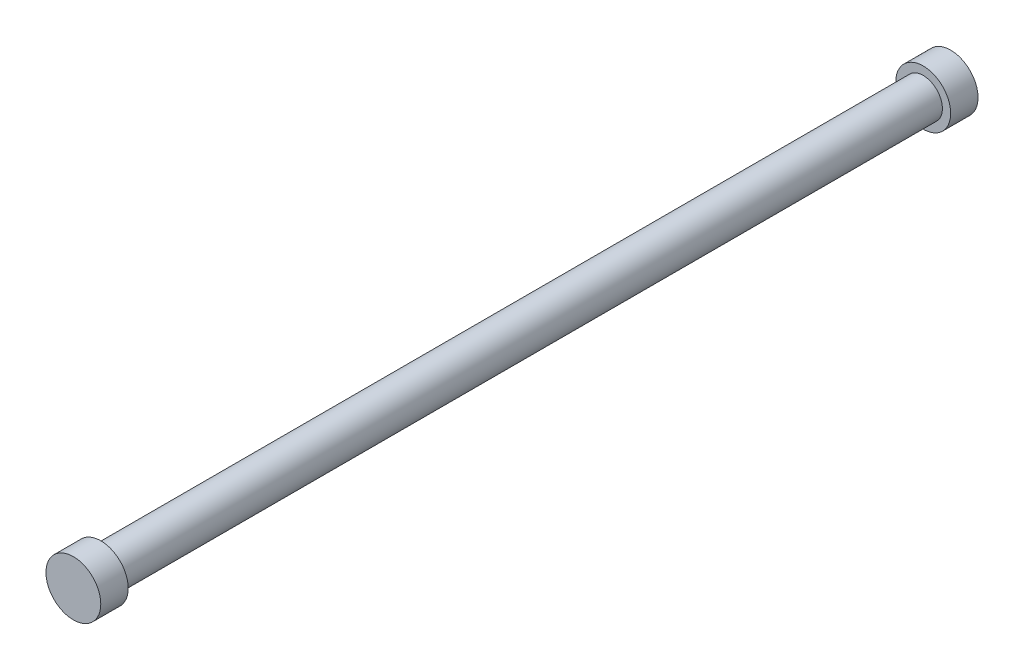
ISO-10303-21;
HEADER;
FILE_DESCRIPTION(('STEP AP214'),'2;1');
FILE_NAME('part.step','',(''),(''),'','','');
FILE_SCHEMA(('AUTOMOTIVE_DESIGN { 1 0 10303 214 1 1 1 1 }'));
ENDSEC;
DATA;
#1=APPLICATION_CONTEXT('core data for automotive mechanical design processes');
#2=APPLICATION_PROTOCOL_DEFINITION('international standard','automotive_design',2000,#1);
#3=PRODUCT_CONTEXT('',#1,'mechanical');
#4=PRODUCT('Part','Part','',(#3));
#5=PRODUCT_RELATED_PRODUCT_CATEGORY('part','',(#4));
#6=PRODUCT_DEFINITION_FORMATION('','',#4);
#7=PRODUCT_DEFINITION_CONTEXT('part definition',#1,'design');
#8=PRODUCT_DEFINITION('design','',#6,#7);
#9=PRODUCT_DEFINITION_SHAPE('','',#8);
#10=(LENGTH_UNIT() NAMED_UNIT(*) SI_UNIT(.MILLI.,.METRE.));
#11=(NAMED_UNIT(*) PLANE_ANGLE_UNIT() SI_UNIT($,.RADIAN.));
#12=(NAMED_UNIT(*) SI_UNIT($,.STERADIAN.) SOLID_ANGLE_UNIT());
#13=UNCERTAINTY_MEASURE_WITH_UNIT(LENGTH_MEASURE(1.E-05),#10,'distance_accuracy_value','');
#14=(GEOMETRIC_REPRESENTATION_CONTEXT(3) GLOBAL_UNCERTAINTY_ASSIGNED_CONTEXT((#13)) GLOBAL_UNIT_ASSIGNED_CONTEXT((#10,
#11,#12)) REPRESENTATION_CONTEXT('',''));
#15=CARTESIAN_POINT('',(0.,0.,0.));
#16=DIRECTION('',(0.,0.,1.));
#17=DIRECTION('',(1.,0.,0.));
#18=AXIS2_PLACEMENT_3D('',#15,#16,#17);
#19=CARTESIAN_POINT('',(0.,0.,320.));
#20=DIRECTION('',(0.,0.,-1.));
#21=DIRECTION('',(-1.,0.,0.));
#22=AXIS2_PLACEMENT_3D('',#19,#20,#21);
#23=CYLINDRICAL_SURFACE('',#22,7.);
#24=CARTESIAN_POINT('',(0.,0.,310.));
#25=DIRECTION('',(0.,0.,1.));
#26=DIRECTION('',(1.,0.,0.));
#27=AXIS2_PLACEMENT_3D('',#24,#25,#26);
#28=CIRCLE('',#27,7.);
#29=CARTESIAN_POINT('',(7.,0.,310.));
#30=VERTEX_POINT('',#29);
#31=EDGE_CURVE('E50',#30,#30,#28,.T.);
#32=ORIENTED_EDGE('',*,*,#31,.F.);
#33=EDGE_LOOP('',(#32));
#34=FACE_BOUND('',#33,.T.);
#35=CARTESIAN_POINT('',(0.,0.,10.));
#36=DIRECTION('',(0.,0.,-1.));
#37=DIRECTION('',(-1.,0.,0.));
#38=AXIS2_PLACEMENT_3D('',#35,#36,#37);
#39=CIRCLE('',#38,7.);
#40=CARTESIAN_POINT('',(-7.,0.,10.));
#41=VERTEX_POINT('',#40);
#42=EDGE_CURVE('E10',#41,#41,#39,.T.);
#43=ORIENTED_EDGE('',*,*,#42,.F.);
#44=EDGE_LOOP('',(#43));
#45=FACE_BOUND('',#44,.T.);
#46=ADVANCED_FACE('F43',(#34,#45),#23,.T.);
#47=CARTESIAN_POINT('',(0.,0.,310.));
#48=DIRECTION('',(0.,0.,1.));
#49=DIRECTION('',(1.,0.,0.));
#50=AXIS2_PLACEMENT_3D('',#47,#48,#49);
#51=CYLINDRICAL_SURFACE('',#50,10.);
#52=CARTESIAN_POINT('',(0.,0.,310.));
#53=DIRECTION('',(0.,0.,1.));
#54=DIRECTION('',(1.,0.,0.));
#55=AXIS2_PLACEMENT_3D('',#52,#53,#54);
#56=CIRCLE('',#55,10.);
#57=CARTESIAN_POINT('',(10.,0.,310.));
#58=VERTEX_POINT('',#57);
#59=EDGE_CURVE('E56',#58,#58,#56,.T.);
#60=ORIENTED_EDGE('',*,*,#59,.T.);
#61=EDGE_LOOP('',(#60));
#62=FACE_BOUND('',#61,.T.);
#63=CARTESIAN_POINT('',(0.,0.,320.));
#64=DIRECTION('',(0.,0.,1.));
#65=DIRECTION('',(1.,0.,0.));
#66=AXIS2_PLACEMENT_3D('',#63,#64,#65);
#67=CIRCLE('',#66,10.);
#68=CARTESIAN_POINT('',(10.,0.,320.));
#69=VERTEX_POINT('',#68);
#70=EDGE_CURVE('E62',#69,#69,#67,.T.);
#71=ORIENTED_EDGE('',*,*,#70,.F.);
#72=EDGE_LOOP('',(#71));
#73=FACE_BOUND('',#72,.T.);
#74=ADVANCED_FACE('F90',(#62,#73),#51,.T.);
#75=CARTESIAN_POINT('',(0.,0.,310.));
#76=DIRECTION('',(0.,0.,1.));
#77=DIRECTION('',(1.,0.,0.));
#78=AXIS2_PLACEMENT_3D('',#75,#76,#77);
#79=PLANE('',#78);
#80=ORIENTED_EDGE('',*,*,#31,.T.);
#81=EDGE_LOOP('',(#80));
#82=FACE_BOUND('',#81,.T.);
#83=ORIENTED_EDGE('',*,*,#59,.F.);
#84=EDGE_LOOP('',(#83));
#85=FACE_BOUND('',#84,.T.);
#86=ADVANCED_FACE('F95',(#82,#85),#79,.F.);
#87=CARTESIAN_POINT('',(0.,0.,320.));
#88=DIRECTION('',(0.,0.,1.));
#89=DIRECTION('',(1.,0.,0.));
#90=AXIS2_PLACEMENT_3D('',#87,#88,#89);
#91=PLANE('',#90);
#92=ORIENTED_EDGE('',*,*,#70,.T.);
#93=EDGE_LOOP('',(#92));
#94=FACE_BOUND('',#93,.T.);
#95=ADVANCED_FACE('F87',(#94),#91,.T.);
#96=CARTESIAN_POINT('',(0.,0.,10.));
#97=DIRECTION('',(0.,0.,-1.));
#98=DIRECTION('',(-1.,0.,0.));
#99=AXIS2_PLACEMENT_3D('',#96,#97,#98);
#100=CYLINDRICAL_SURFACE('',#99,10.);
#101=CARTESIAN_POINT('',(0.,0.,10.));
#102=DIRECTION('',(0.,0.,-1.));
#103=DIRECTION('',(-1.,0.,0.));
#104=AXIS2_PLACEMENT_3D('',#101,#102,#103);
#105=CIRCLE('',#104,10.);
#106=CARTESIAN_POINT('',(-10.,0.,10.));
#107=VERTEX_POINT('',#106);
#108=EDGE_CURVE('E67',#107,#107,#105,.T.);
#109=ORIENTED_EDGE('',*,*,#108,.T.);
#110=EDGE_LOOP('',(#109));
#111=FACE_BOUND('',#110,.T.);
#112=CARTESIAN_POINT('',(0.,0.,0.));
#113=DIRECTION('',(0.,0.,-1.));
#114=DIRECTION('',(-1.,0.,0.));
#115=AXIS2_PLACEMENT_3D('',#112,#113,#114);
#116=CIRCLE('',#115,10.);
#117=CARTESIAN_POINT('',(-10.,0.,0.));
#118=VERTEX_POINT('',#117);
#119=EDGE_CURVE('E69',#118,#118,#116,.T.);
#120=ORIENTED_EDGE('',*,*,#119,.F.);
#121=EDGE_LOOP('',(#120));
#122=FACE_BOUND('',#121,.T.);
#123=ADVANCED_FACE('F75',(#111,#122),#100,.T.);
#124=CARTESIAN_POINT('',(0.,0.,10.));
#125=DIRECTION('',(0.,0.,-1.));
#126=DIRECTION('',(-1.,0.,0.));
#127=AXIS2_PLACEMENT_3D('',#124,#125,#126);
#128=PLANE('',#127);
#129=ORIENTED_EDGE('',*,*,#42,.T.);
#130=EDGE_LOOP('',(#129));
#131=FACE_BOUND('',#130,.T.);
#132=ORIENTED_EDGE('',*,*,#108,.F.);
#133=EDGE_LOOP('',(#132));
#134=FACE_BOUND('',#133,.T.);
#135=ADVANCED_FACE('F78',(#131,#134),#128,.F.);
#136=CARTESIAN_POINT('',(0.,0.,0.));
#137=DIRECTION('',(0.,0.,1.));
#138=DIRECTION('',(1.,0.,0.));
#139=AXIS2_PLACEMENT_3D('',#136,#137,#138);
#140=PLANE('',#139);
#141=ORIENTED_EDGE('',*,*,#119,.T.);
#142=EDGE_LOOP('',(#141));
#143=FACE_BOUND('',#142,.T.);
#144=ADVANCED_FACE('F80',(#143),#140,.F.);
#145=CLOSED_SHELL('',(#46,#74,#86,#95,#123,#135,#144));
#146=MANIFOLD_SOLID_BREP('B2',#145);
#147=ADVANCED_BREP_SHAPE_REPRESENTATION('',(#18,#146),#14);
#148=SHAPE_DEFINITION_REPRESENTATION(#9,#147);
ENDSEC;
END-ISO-10303-21;
